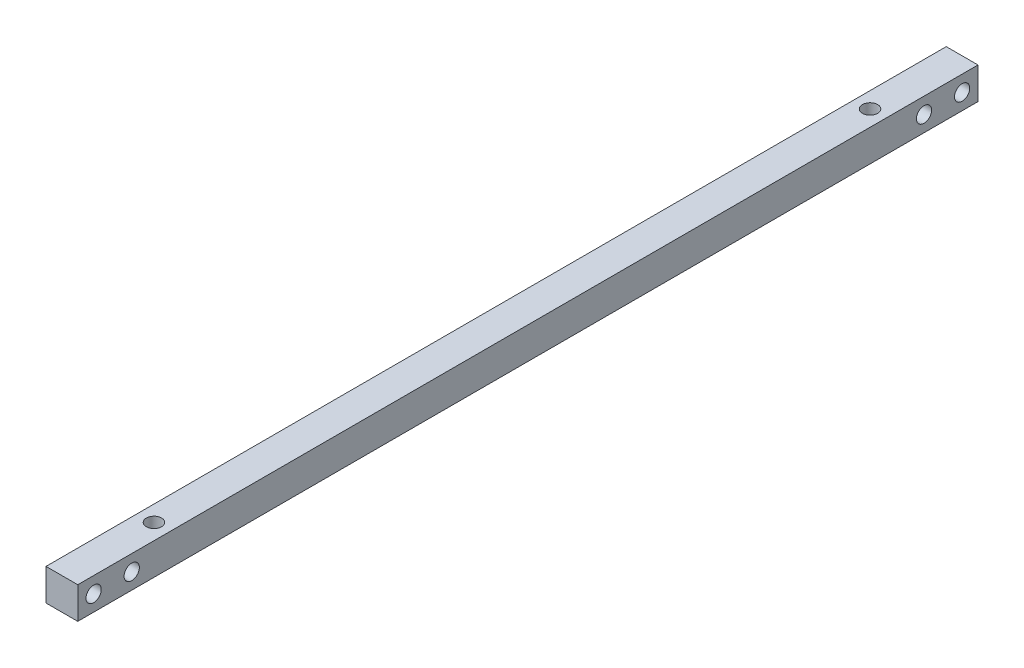
ISO-10303-21;
HEADER;
FILE_DESCRIPTION(('STEP AP214'),'2;1');
FILE_NAME('part.step','',(''),(''),'','','');
FILE_SCHEMA(('AUTOMOTIVE_DESIGN { 1 0 10303 214 1 1 1 1 }'));
ENDSEC;
DATA;
#1=APPLICATION_CONTEXT('core data for automotive mechanical design processes');
#2=APPLICATION_PROTOCOL_DEFINITION('international standard','automotive_design',2000,#1);
#3=PRODUCT_CONTEXT('',#1,'mechanical');
#4=PRODUCT('Part','Part','',(#3));
#5=PRODUCT_RELATED_PRODUCT_CATEGORY('part','',(#4));
#6=PRODUCT_DEFINITION_FORMATION('','',#4);
#7=PRODUCT_DEFINITION_CONTEXT('part definition',#1,'design');
#8=PRODUCT_DEFINITION('design','',#6,#7);
#9=PRODUCT_DEFINITION_SHAPE('','',#8);
#10=(LENGTH_UNIT() NAMED_UNIT(*) SI_UNIT(.MILLI.,.METRE.));
#11=(NAMED_UNIT(*) PLANE_ANGLE_UNIT() SI_UNIT($,.RADIAN.));
#12=(NAMED_UNIT(*) SI_UNIT($,.STERADIAN.) SOLID_ANGLE_UNIT());
#13=UNCERTAINTY_MEASURE_WITH_UNIT(LENGTH_MEASURE(1.E-05),#10,'distance_accuracy_value','');
#14=(GEOMETRIC_REPRESENTATION_CONTEXT(3) GLOBAL_UNCERTAINTY_ASSIGNED_CONTEXT((#13)) GLOBAL_UNIT_ASSIGNED_CONTEXT((#10,
#11,#12)) REPRESENTATION_CONTEXT('',''));
#15=CARTESIAN_POINT('',(0.,0.,0.));
#16=DIRECTION('',(0.,0.,1.));
#17=DIRECTION('',(1.,0.,0.));
#18=AXIS2_PLACEMENT_3D('',#15,#16,#17);
#19=CARTESIAN_POINT('',(3.125,-3.125,88.6));
#20=DIRECTION('',(0.,0.,-1.));
#21=DIRECTION('',(-1.,0.,0.));
#22=AXIS2_PLACEMENT_3D('',#19,#20,#21);
#23=PLANE('',#22);
#24=DIRECTION('',(0.,-1.,0.));
#25=VECTOR('',#24,1.);
#26=CARTESIAN_POINT('',(-3.125,-3.125,88.6));
#27=LINE('',#26,#25);
#28=CARTESIAN_POINT('',(-3.125,3.125,88.6));
#29=VERTEX_POINT('',#28);
#30=CARTESIAN_POINT('',(-3.125,-3.125,88.6));
#31=VERTEX_POINT('',#30);
#32=EDGE_CURVE('E99',#29,#31,#27,.T.);
#33=ORIENTED_EDGE('',*,*,#32,.T.);
#34=DIRECTION('',(-1.,0.,0.));
#35=VECTOR('',#34,1.);
#36=CARTESIAN_POINT('',(3.125,-3.125,88.6));
#37=LINE('',#36,#35);
#38=CARTESIAN_POINT('',(3.125,-3.125,88.6));
#39=VERTEX_POINT('',#38);
#40=EDGE_CURVE('E11',#39,#31,#37,.T.);
#41=ORIENTED_EDGE('',*,*,#40,.F.);
#42=DIRECTION('',(0.,-1.,0.));
#43=VECTOR('',#42,1.);
#44=CARTESIAN_POINT('',(3.125,-3.125,88.6));
#45=LINE('',#44,#43);
#46=CARTESIAN_POINT('',(3.125,3.125,88.6));
#47=VERTEX_POINT('',#46);
#48=EDGE_CURVE('E86',#47,#39,#45,.T.);
#49=ORIENTED_EDGE('',*,*,#48,.F.);
#50=DIRECTION('',(-1.,0.,0.));
#51=VECTOR('',#50,1.);
#52=CARTESIAN_POINT('',(3.125,3.125,88.6));
#53=LINE('',#52,#51);
#54=EDGE_CURVE('E95',#47,#29,#53,.T.);
#55=ORIENTED_EDGE('',*,*,#54,.T.);
#56=EDGE_LOOP('',(#33,#41,#49,#55));
#57=FACE_BOUND('',#56,.T.);
#58=ADVANCED_FACE('F33',(#57),#23,.F.);
#59=CARTESIAN_POINT('',(3.125,-3.125,88.6));
#60=DIRECTION('',(0.,1.,0.));
#61=DIRECTION('',(0.,0.,1.));
#62=AXIS2_PLACEMENT_3D('',#59,#60,#61);
#63=PLANE('',#62);
#64=CARTESIAN_POINT('',(0.,-3.125,70.475));
#65=DIRECTION('',(0.,-1.,0.));
#66=DIRECTION('',(0.,0.,-1.));
#67=AXIS2_PLACEMENT_3D('',#64,#65,#66);
#68=CIRCLE('',#67,1.5);
#69=CARTESIAN_POINT('',(0.,-3.125,68.975));
#70=VERTEX_POINT('',#69);
#71=EDGE_CURVE('E132',#70,#70,#68,.T.);
#72=ORIENTED_EDGE('',*,*,#71,.F.);
#73=EDGE_LOOP('',(#72));
#74=FACE_BOUND('',#73,.T.);
#75=CARTESIAN_POINT('',(0.,-3.12500000000001,-70.475));
#76=DIRECTION('',(0.,-1.,0.));
#77=DIRECTION('',(0.,0.,-1.));
#78=AXIS2_PLACEMENT_3D('',#75,#76,#77);
#79=CIRCLE('',#78,1.5);
#80=CARTESIAN_POINT('',(0.,-3.12500000000001,-71.975));
#81=VERTEX_POINT('',#80);
#82=EDGE_CURVE('E124',#81,#81,#79,.T.);
#83=ORIENTED_EDGE('',*,*,#82,.F.);
#84=EDGE_LOOP('',(#83));
#85=FACE_BOUND('',#84,.T.);
#86=DIRECTION('',(0.,0.,-1.));
#87=VECTOR('',#86,1.);
#88=CARTESIAN_POINT('',(-3.125,-3.125,88.6));
#89=LINE('',#88,#87);
#90=CARTESIAN_POINT('',(-3.125,-3.12500000000001,-88.6));
#91=VERTEX_POINT('',#90);
#92=EDGE_CURVE('E90',#31,#91,#89,.T.);
#93=ORIENTED_EDGE('',*,*,#92,.T.);
#94=DIRECTION('',(-1.,0.,0.));
#95=VECTOR('',#94,1.);
#96=CARTESIAN_POINT('',(3.125,-3.12500000000001,-88.6));
#97=LINE('',#96,#95);
#98=CARTESIAN_POINT('',(3.125,-3.12500000000001,-88.6));
#99=VERTEX_POINT('',#98);
#100=EDGE_CURVE('E42',#99,#91,#97,.T.);
#101=ORIENTED_EDGE('',*,*,#100,.F.);
#102=DIRECTION('',(0.,0.,-1.));
#103=VECTOR('',#102,1.);
#104=CARTESIAN_POINT('',(3.125,-3.125,88.6));
#105=LINE('',#104,#103);
#106=EDGE_CURVE('E81',#39,#99,#105,.T.);
#107=ORIENTED_EDGE('',*,*,#106,.F.);
#108=ORIENTED_EDGE('',*,*,#40,.T.);
#109=EDGE_LOOP('',(#93,#101,#107,#108));
#110=FACE_BOUND('',#109,.T.);
#111=ADVANCED_FACE('F89',(#74,#85,#110),#63,.F.);
#112=CARTESIAN_POINT('',(3.125,-3.12500000000001,-88.6));
#113=DIRECTION('',(0.,0.,1.));
#114=DIRECTION('',(1.,0.,0.));
#115=AXIS2_PLACEMENT_3D('',#112,#113,#114);
#116=PLANE('',#115);
#117=DIRECTION('',(0.,1.,0.));
#118=VECTOR('',#117,1.);
#119=CARTESIAN_POINT('',(-3.125,-3.12500000000001,-88.6));
#120=LINE('',#119,#118);
#121=CARTESIAN_POINT('',(-3.125,3.12500000000001,-88.6));
#122=VERTEX_POINT('',#121);
#123=EDGE_CURVE('E68',#91,#122,#120,.T.);
#124=ORIENTED_EDGE('',*,*,#123,.T.);
#125=DIRECTION('',(-1.,0.,0.));
#126=VECTOR('',#125,1.);
#127=CARTESIAN_POINT('',(3.125,3.12500000000001,-88.6));
#128=LINE('',#127,#126);
#129=CARTESIAN_POINT('',(3.125,3.12500000000001,-88.6));
#130=VERTEX_POINT('',#129);
#131=EDGE_CURVE('E91',#130,#122,#128,.T.);
#132=ORIENTED_EDGE('',*,*,#131,.F.);
#133=DIRECTION('',(0.,1.,0.));
#134=VECTOR('',#133,1.);
#135=CARTESIAN_POINT('',(3.125,-3.12500000000001,-88.6));
#136=LINE('',#135,#134);
#137=EDGE_CURVE('E84',#99,#130,#136,.T.);
#138=ORIENTED_EDGE('',*,*,#137,.F.);
#139=ORIENTED_EDGE('',*,*,#100,.T.);
#140=EDGE_LOOP('',(#124,#132,#138,#139));
#141=FACE_BOUND('',#140,.T.);
#142=ADVANCED_FACE('F93',(#141),#116,.F.);
#143=CARTESIAN_POINT('',(3.125,3.125,88.6));
#144=DIRECTION('',(0.,-1.,0.));
#145=DIRECTION('',(0.,0.,-1.));
#146=AXIS2_PLACEMENT_3D('',#143,#144,#145);
#147=PLANE('',#146);
#148=CARTESIAN_POINT('',(0.,3.12499999999999,70.475));
#149=DIRECTION('',(0.,-1.,0.));
#150=DIRECTION('',(0.,0.,-1.));
#151=AXIS2_PLACEMENT_3D('',#148,#149,#150);
#152=CIRCLE('',#151,1.5);
#153=CARTESIAN_POINT('',(0.,3.12499999999999,68.975));
#154=VERTEX_POINT('',#153);
#155=EDGE_CURVE('E36',#154,#154,#152,.T.);
#156=ORIENTED_EDGE('',*,*,#155,.T.);
#157=EDGE_LOOP('',(#156));
#158=FACE_BOUND('',#157,.T.);
#159=CARTESIAN_POINT('',(0.,3.12499999999999,-70.475));
#160=DIRECTION('',(0.,-1.,0.));
#161=DIRECTION('',(0.,0.,-1.));
#162=AXIS2_PLACEMENT_3D('',#159,#160,#161);
#163=CIRCLE('',#162,1.5);
#164=CARTESIAN_POINT('',(0.,3.12499999999999,-71.975));
#165=VERTEX_POINT('',#164);
#166=EDGE_CURVE('E122',#165,#165,#163,.T.);
#167=ORIENTED_EDGE('',*,*,#166,.T.);
#168=EDGE_LOOP('',(#167));
#169=FACE_BOUND('',#168,.T.);
#170=DIRECTION('',(0.,0.,1.));
#171=VECTOR('',#170,1.);
#172=CARTESIAN_POINT('',(-3.125,3.125,88.6));
#173=LINE('',#172,#171);
#174=EDGE_CURVE('E74',#122,#29,#173,.T.);
#175=ORIENTED_EDGE('',*,*,#174,.T.);
#176=ORIENTED_EDGE('',*,*,#54,.F.);
#177=DIRECTION('',(0.,0.,1.));
#178=VECTOR('',#177,1.);
#179=CARTESIAN_POINT('',(3.125,3.125,88.6));
#180=LINE('',#179,#178);
#181=EDGE_CURVE('E51',#130,#47,#180,.T.);
#182=ORIENTED_EDGE('',*,*,#181,.F.);
#183=ORIENTED_EDGE('',*,*,#131,.T.);
#184=EDGE_LOOP('',(#175,#176,#182,#183));
#185=FACE_BOUND('',#184,.T.);
#186=ADVANCED_FACE('F169',(#158,#169,#185),#147,.F.);
#187=CARTESIAN_POINT('',(3.125,0.,0.));
#188=DIRECTION('',(-1.,0.,0.));
#189=DIRECTION('',(0.,0.,1.));
#190=AXIS2_PLACEMENT_3D('',#187,#188,#189);
#191=PLANE('',#190);
#192=CARTESIAN_POINT('',(3.125,0.,77.975));
#193=DIRECTION('',(-1.,0.,0.));
#194=DIRECTION('',(0.,0.,1.));
#195=AXIS2_PLACEMENT_3D('',#192,#193,#194);
#196=CIRCLE('',#195,1.5);
#197=CARTESIAN_POINT('',(3.125,0.,79.475));
#198=VERTEX_POINT('',#197);
#199=EDGE_CURVE('E119',#198,#198,#196,.T.);
#200=ORIENTED_EDGE('',*,*,#199,.T.);
#201=EDGE_LOOP('',(#200));
#202=FACE_BOUND('',#201,.T.);
#203=CARTESIAN_POINT('',(3.125,0.,85.475));
#204=DIRECTION('',(-1.,0.,0.));
#205=DIRECTION('',(0.,0.,1.));
#206=AXIS2_PLACEMENT_3D('',#203,#204,#205);
#207=CIRCLE('',#206,1.5);
#208=CARTESIAN_POINT('',(3.125,0.,86.975));
#209=VERTEX_POINT('',#208);
#210=EDGE_CURVE('E115',#209,#209,#207,.T.);
#211=ORIENTED_EDGE('',*,*,#210,.T.);
#212=EDGE_LOOP('',(#211));
#213=FACE_BOUND('',#212,.T.);
#214=CARTESIAN_POINT('',(3.125,0.,-77.975));
#215=DIRECTION('',(-1.,0.,0.));
#216=DIRECTION('',(0.,0.,1.));
#217=AXIS2_PLACEMENT_3D('',#214,#215,#216);
#218=CIRCLE('',#217,1.5);
#219=CARTESIAN_POINT('',(3.125,0.,-76.475));
#220=VERTEX_POINT('',#219);
#221=EDGE_CURVE('E111',#220,#220,#218,.T.);
#222=ORIENTED_EDGE('',*,*,#221,.T.);
#223=EDGE_LOOP('',(#222));
#224=FACE_BOUND('',#223,.T.);
#225=CARTESIAN_POINT('',(3.125,0.,-85.475));
#226=DIRECTION('',(-1.,0.,0.));
#227=DIRECTION('',(0.,0.,1.));
#228=AXIS2_PLACEMENT_3D('',#225,#226,#227);
#229=CIRCLE('',#228,1.5);
#230=CARTESIAN_POINT('',(3.125,0.,-83.975));
#231=VERTEX_POINT('',#230);
#232=EDGE_CURVE('E102',#231,#231,#229,.T.);
#233=ORIENTED_EDGE('',*,*,#232,.T.);
#234=EDGE_LOOP('',(#233));
#235=FACE_BOUND('',#234,.T.);
#236=ORIENTED_EDGE('',*,*,#48,.T.);
#237=ORIENTED_EDGE('',*,*,#106,.T.);
#238=ORIENTED_EDGE('',*,*,#137,.T.);
#239=ORIENTED_EDGE('',*,*,#181,.T.);
#240=EDGE_LOOP('',(#236,#237,#238,#239));
#241=FACE_BOUND('',#240,.T.);
#242=ADVANCED_FACE('F82',(#202,#213,#224,#235,#241),#191,.F.);
#243=CARTESIAN_POINT('',(-3.125,0.,0.));
#244=DIRECTION('',(-1.,0.,0.));
#245=DIRECTION('',(0.,0.,1.));
#246=AXIS2_PLACEMENT_3D('',#243,#244,#245);
#247=PLANE('',#246);
#248=CARTESIAN_POINT('',(-3.125,0.,77.975));
#249=DIRECTION('',(-1.,0.,0.));
#250=DIRECTION('',(0.,0.,1.));
#251=AXIS2_PLACEMENT_3D('',#248,#249,#250);
#252=CIRCLE('',#251,1.5);
#253=CARTESIAN_POINT('',(-3.125,0.,79.475));
#254=VERTEX_POINT('',#253);
#255=EDGE_CURVE('E120',#254,#254,#252,.T.);
#256=ORIENTED_EDGE('',*,*,#255,.F.);
#257=EDGE_LOOP('',(#256));
#258=FACE_BOUND('',#257,.T.);
#259=CARTESIAN_POINT('',(-3.125,0.,85.475));
#260=DIRECTION('',(-1.,0.,0.));
#261=DIRECTION('',(0.,0.,1.));
#262=AXIS2_PLACEMENT_3D('',#259,#260,#261);
#263=CIRCLE('',#262,1.5);
#264=CARTESIAN_POINT('',(-3.125,0.,86.975));
#265=VERTEX_POINT('',#264);
#266=EDGE_CURVE('E116',#265,#265,#263,.T.);
#267=ORIENTED_EDGE('',*,*,#266,.F.);
#268=EDGE_LOOP('',(#267));
#269=FACE_BOUND('',#268,.T.);
#270=CARTESIAN_POINT('',(-3.125,0.,-77.975));
#271=DIRECTION('',(-1.,0.,0.));
#272=DIRECTION('',(0.,0.,1.));
#273=AXIS2_PLACEMENT_3D('',#270,#271,#272);
#274=CIRCLE('',#273,1.5);
#275=CARTESIAN_POINT('',(-3.125,0.,-76.475));
#276=VERTEX_POINT('',#275);
#277=EDGE_CURVE('E112',#276,#276,#274,.T.);
#278=ORIENTED_EDGE('',*,*,#277,.F.);
#279=EDGE_LOOP('',(#278));
#280=FACE_BOUND('',#279,.T.);
#281=CARTESIAN_POINT('',(-3.125,0.,-85.475));
#282=DIRECTION('',(-1.,0.,0.));
#283=DIRECTION('',(0.,0.,1.));
#284=AXIS2_PLACEMENT_3D('',#281,#282,#283);
#285=CIRCLE('',#284,1.5);
#286=CARTESIAN_POINT('',(-3.125,0.,-83.975));
#287=VERTEX_POINT('',#286);
#288=EDGE_CURVE('E108',#287,#287,#285,.T.);
#289=ORIENTED_EDGE('',*,*,#288,.F.);
#290=EDGE_LOOP('',(#289));
#291=FACE_BOUND('',#290,.T.);
#292=ORIENTED_EDGE('',*,*,#32,.F.);
#293=ORIENTED_EDGE('',*,*,#174,.F.);
#294=ORIENTED_EDGE('',*,*,#123,.F.);
#295=ORIENTED_EDGE('',*,*,#92,.F.);
#296=EDGE_LOOP('',(#292,#293,#294,#295));
#297=FACE_BOUND('',#296,.T.);
#298=ADVANCED_FACE('F148',(#258,#269,#280,#291,#297),#247,.T.);
#299=CARTESIAN_POINT('',(-11.875,0.,-85.475));
#300=DIRECTION('',(1.,0.,0.));
#301=DIRECTION('',(0.,0.,-1.));
#302=AXIS2_PLACEMENT_3D('',#299,#300,#301);
#303=CYLINDRICAL_SURFACE('',#302,1.5);
#304=ORIENTED_EDGE('',*,*,#288,.T.);
#305=EDGE_LOOP('',(#304));
#306=FACE_BOUND('',#305,.T.);
#307=ORIENTED_EDGE('',*,*,#232,.F.);
#308=EDGE_LOOP('',(#307));
#309=FACE_BOUND('',#308,.T.);
#310=ADVANCED_FACE('F145',(#306,#309),#303,.F.);
#311=CARTESIAN_POINT('',(-11.875,0.,-77.975));
#312=DIRECTION('',(1.,0.,0.));
#313=DIRECTION('',(0.,0.,-1.));
#314=AXIS2_PLACEMENT_3D('',#311,#312,#313);
#315=CYLINDRICAL_SURFACE('',#314,1.5);
#316=ORIENTED_EDGE('',*,*,#277,.T.);
#317=EDGE_LOOP('',(#316));
#318=FACE_BOUND('',#317,.T.);
#319=ORIENTED_EDGE('',*,*,#221,.F.);
#320=EDGE_LOOP('',(#319));
#321=FACE_BOUND('',#320,.T.);
#322=ADVANCED_FACE('F147',(#318,#321),#315,.F.);
#323=CARTESIAN_POINT('',(-11.875,0.,85.475));
#324=DIRECTION('',(1.,0.,0.));
#325=DIRECTION('',(0.,0.,-1.));
#326=AXIS2_PLACEMENT_3D('',#323,#324,#325);
#327=CYLINDRICAL_SURFACE('',#326,1.5);
#328=ORIENTED_EDGE('',*,*,#266,.T.);
#329=EDGE_LOOP('',(#328));
#330=FACE_BOUND('',#329,.T.);
#331=ORIENTED_EDGE('',*,*,#210,.F.);
#332=EDGE_LOOP('',(#331));
#333=FACE_BOUND('',#332,.T.);
#334=ADVANCED_FACE('F155',(#330,#333),#327,.F.);
#335=CARTESIAN_POINT('',(-11.875,0.,77.975));
#336=DIRECTION('',(1.,0.,0.));
#337=DIRECTION('',(0.,0.,-1.));
#338=AXIS2_PLACEMENT_3D('',#335,#336,#337);
#339=CYLINDRICAL_SURFACE('',#338,1.5);
#340=ORIENTED_EDGE('',*,*,#255,.T.);
#341=EDGE_LOOP('',(#340));
#342=FACE_BOUND('',#341,.T.);
#343=ORIENTED_EDGE('',*,*,#199,.F.);
#344=EDGE_LOOP('',(#343));
#345=FACE_BOUND('',#344,.T.);
#346=ADVANCED_FACE('F189',(#342,#345),#339,.F.);
#347=CARTESIAN_POINT('',(0.,364.875,-70.475));
#348=DIRECTION('',(0.,-1.,0.));
#349=DIRECTION('',(0.,0.,-1.));
#350=AXIS2_PLACEMENT_3D('',#347,#348,#349);
#351=CYLINDRICAL_SURFACE('',#350,1.5);
#352=ORIENTED_EDGE('',*,*,#82,.T.);
#353=EDGE_LOOP('',(#352));
#354=FACE_BOUND('',#353,.T.);
#355=ORIENTED_EDGE('',*,*,#166,.F.);
#356=EDGE_LOOP('',(#355));
#357=FACE_BOUND('',#356,.T.);
#358=ADVANCED_FACE('F183',(#354,#357),#351,.F.);
#359=CARTESIAN_POINT('',(0.,364.875,70.475));
#360=DIRECTION('',(0.,-1.,0.));
#361=DIRECTION('',(0.,0.,-1.));
#362=AXIS2_PLACEMENT_3D('',#359,#360,#361);
#363=CYLINDRICAL_SURFACE('',#362,1.5);
#364=ORIENTED_EDGE('',*,*,#71,.T.);
#365=EDGE_LOOP('',(#364));
#366=FACE_BOUND('',#365,.T.);
#367=ORIENTED_EDGE('',*,*,#155,.F.);
#368=EDGE_LOOP('',(#367));
#369=FACE_BOUND('',#368,.T.);
#370=ADVANCED_FACE('F181',(#366,#369),#363,.F.);
#371=CLOSED_SHELL('',(#58,#111,#142,#186,#242,#298,#310,#322,#334,#346,#358,#370));
#372=MANIFOLD_SOLID_BREP('B2',#371);
#373=ADVANCED_BREP_SHAPE_REPRESENTATION('',(#18,#372),#14);
#374=SHAPE_DEFINITION_REPRESENTATION(#9,#373);
ENDSEC;
END-ISO-10303-21;
